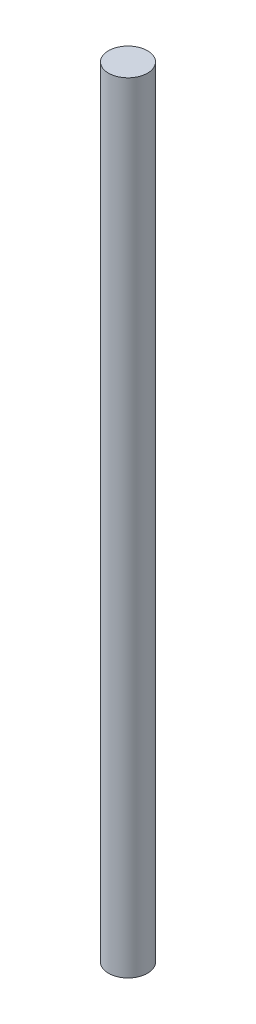
ISO-10303-21;
HEADER;
FILE_DESCRIPTION(('STEP AP214'),'2;1');
FILE_NAME('part.step','',(''),(''),'','','');
FILE_SCHEMA(('AUTOMOTIVE_DESIGN { 1 0 10303 214 1 1 1 1 }'));
ENDSEC;
DATA;
#1=APPLICATION_CONTEXT('core data for automotive mechanical design processes');
#2=APPLICATION_PROTOCOL_DEFINITION('international standard','automotive_design',2000,#1);
#3=PRODUCT_CONTEXT('',#1,'mechanical');
#4=PRODUCT('Part','Part','',(#3));
#5=PRODUCT_RELATED_PRODUCT_CATEGORY('part','',(#4));
#6=PRODUCT_DEFINITION_FORMATION('','',#4);
#7=PRODUCT_DEFINITION_CONTEXT('part definition',#1,'design');
#8=PRODUCT_DEFINITION('design','',#6,#7);
#9=PRODUCT_DEFINITION_SHAPE('','',#8);
#10=(LENGTH_UNIT() NAMED_UNIT(*) SI_UNIT(.MILLI.,.METRE.));
#11=(NAMED_UNIT(*) PLANE_ANGLE_UNIT() SI_UNIT($,.RADIAN.));
#12=(NAMED_UNIT(*) SI_UNIT($,.STERADIAN.) SOLID_ANGLE_UNIT());
#13=UNCERTAINTY_MEASURE_WITH_UNIT(LENGTH_MEASURE(1.E-05),#10,'distance_accuracy_value','');
#14=(GEOMETRIC_REPRESENTATION_CONTEXT(3) GLOBAL_UNCERTAINTY_ASSIGNED_CONTEXT((#13)) GLOBAL_UNIT_ASSIGNED_CONTEXT((#10,
#11,#12)) REPRESENTATION_CONTEXT('',''));
#15=CARTESIAN_POINT('',(0.,0.,0.));
#16=DIRECTION('',(0.,0.,1.));
#17=DIRECTION('',(1.,0.,0.));
#18=AXIS2_PLACEMENT_3D('',#15,#16,#17);
#19=CARTESIAN_POINT('',(0.,254.,0.));
#20=DIRECTION('',(0.,-1.,0.));
#21=DIRECTION('',(0.,0.,-1.));
#22=AXIS2_PLACEMENT_3D('',#19,#20,#21);
#23=CYLINDRICAL_SURFACE('',#22,6.35);
#24=CARTESIAN_POINT('',(0.,254.,0.));
#25=DIRECTION('',(0.,1.,0.));
#26=DIRECTION('',(0.,0.,1.));
#27=AXIS2_PLACEMENT_3D('',#24,#25,#26);
#28=CIRCLE('',#27,6.35);
#29=CARTESIAN_POINT('',(0.,254.,6.35));
#30=VERTEX_POINT('',#29);
#31=EDGE_CURVE('E10',#30,#30,#28,.T.);
#32=ORIENTED_EDGE('',*,*,#31,.F.);
#33=EDGE_LOOP('',(#32));
#34=FACE_BOUND('',#33,.T.);
#35=CARTESIAN_POINT('',(0.,0.,0.));
#36=DIRECTION('',(0.,1.,0.));
#37=DIRECTION('',(0.,0.,1.));
#38=AXIS2_PLACEMENT_3D('',#35,#36,#37);
#39=CIRCLE('',#38,6.35);
#40=CARTESIAN_POINT('',(0.,0.,6.35));
#41=VERTEX_POINT('',#40);
#42=EDGE_CURVE('E46',#41,#41,#39,.T.);
#43=ORIENTED_EDGE('',*,*,#42,.T.);
#44=EDGE_LOOP('',(#43));
#45=FACE_BOUND('',#44,.T.);
#46=ADVANCED_FACE('F43',(#34,#45),#23,.T.);
#47=CARTESIAN_POINT('',(0.,254.,0.));
#48=DIRECTION('',(0.,1.,0.));
#49=DIRECTION('',(0.,0.,1.));
#50=AXIS2_PLACEMENT_3D('',#47,#48,#49);
#51=PLANE('',#50);
#52=ORIENTED_EDGE('',*,*,#31,.T.);
#53=EDGE_LOOP('',(#52));
#54=FACE_BOUND('',#53,.T.);
#55=ADVANCED_FACE('F60',(#54),#51,.T.);
#56=CARTESIAN_POINT('',(0.,0.,0.));
#57=DIRECTION('',(0.,1.,0.));
#58=DIRECTION('',(0.,0.,1.));
#59=AXIS2_PLACEMENT_3D('',#56,#57,#58);
#60=PLANE('',#59);
#61=ORIENTED_EDGE('',*,*,#42,.F.);
#62=EDGE_LOOP('',(#61));
#63=FACE_BOUND('',#62,.T.);
#64=ADVANCED_FACE('F58',(#63),#60,.F.);
#65=CLOSED_SHELL('',(#46,#55,#64));
#66=MANIFOLD_SOLID_BREP('B2',#65);
#67=ADVANCED_BREP_SHAPE_REPRESENTATION('',(#18,#66),#14);
#68=SHAPE_DEFINITION_REPRESENTATION(#9,#67);
ENDSEC;
END-ISO-10303-21;
